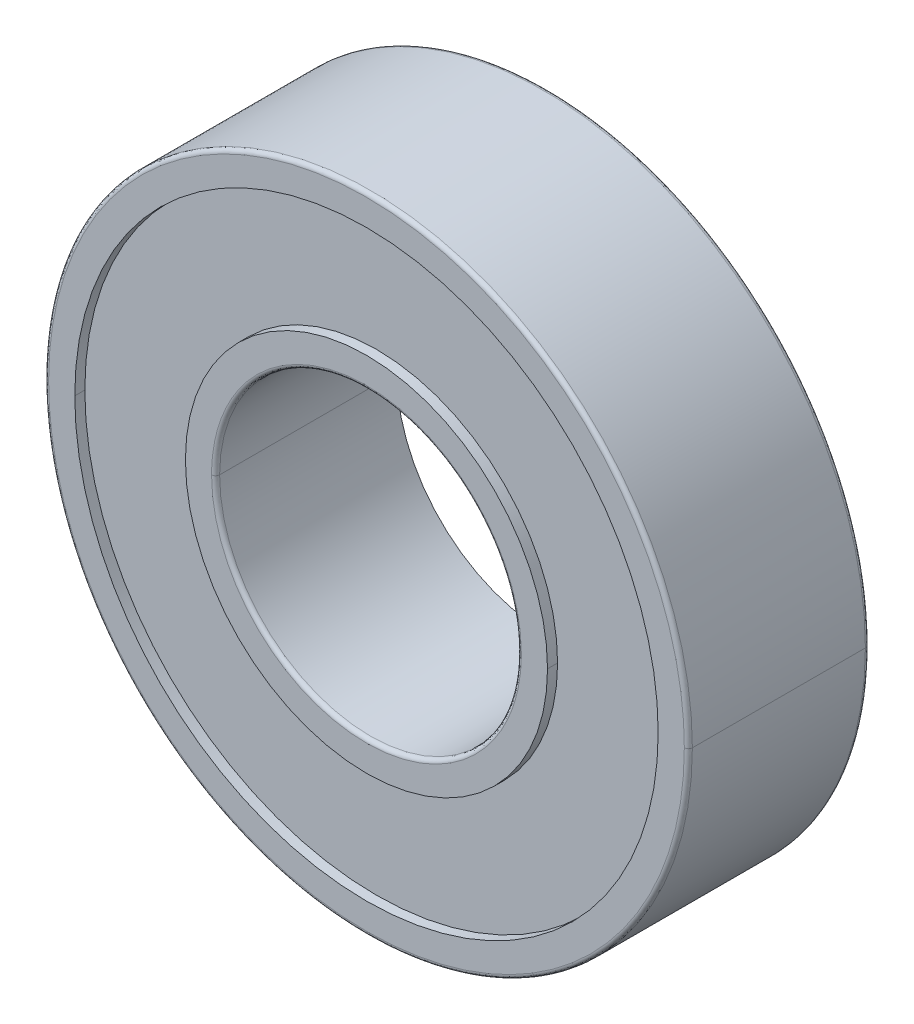
ISO-10303-21;
HEADER;
FILE_DESCRIPTION(('STEP AP214'),'2;1');
FILE_NAME('part.step','',(''),(''),'','','');
FILE_SCHEMA(('AUTOMOTIVE_DESIGN { 1 0 10303 214 1 1 1 1 }'));
ENDSEC;
DATA;
#1=APPLICATION_CONTEXT('core data for automotive mechanical design processes');
#2=APPLICATION_PROTOCOL_DEFINITION('international standard','automotive_design',2000,#1);
#3=PRODUCT_CONTEXT('',#1,'mechanical');
#4=PRODUCT('Part','Part','',(#3));
#5=PRODUCT_RELATED_PRODUCT_CATEGORY('part','',(#4));
#6=PRODUCT_DEFINITION_FORMATION('','',#4);
#7=PRODUCT_DEFINITION_CONTEXT('part definition',#1,'design');
#8=PRODUCT_DEFINITION('design','',#6,#7);
#9=PRODUCT_DEFINITION_SHAPE('','',#8);
#10=(LENGTH_UNIT() NAMED_UNIT(*) SI_UNIT(.MILLI.,.METRE.));
#11=(NAMED_UNIT(*) PLANE_ANGLE_UNIT() SI_UNIT($,.RADIAN.));
#12=(NAMED_UNIT(*) SI_UNIT($,.STERADIAN.) SOLID_ANGLE_UNIT());
#13=UNCERTAINTY_MEASURE_WITH_UNIT(LENGTH_MEASURE(1.E-05),#10,'distance_accuracy_value','');
#14=(GEOMETRIC_REPRESENTATION_CONTEXT(3) GLOBAL_UNCERTAINTY_ASSIGNED_CONTEXT((#13)) GLOBAL_UNIT_ASSIGNED_CONTEXT((#10,
#11,#12)) REPRESENTATION_CONTEXT('',''));
#15=CARTESIAN_POINT('',(0.,0.,0.));
#16=DIRECTION('',(0.,0.,1.));
#17=DIRECTION('',(1.,0.,0.));
#18=AXIS2_PLACEMENT_3D('',#15,#16,#17);
#19=CARTESIAN_POINT('',(0.,0.,8.5));
#20=DIRECTION('',(0.,0.,1.));
#21=DIRECTION('',(1.,0.,0.));
#22=AXIS2_PLACEMENT_3D('',#19,#20,#21);
#23=CYLINDRICAL_SURFACE('',#22,14.5);
#24=DIRECTION('',(0.,0.,1.));
#25=VECTOR('',#24,1.);
#26=CARTESIAN_POINT('',(-14.5,0.,8.5));
#27=LINE('',#26,#25);
#28=CARTESIAN_POINT('',(-14.5,0.,8.5));
#29=VERTEX_POINT('',#28);
#30=CARTESIAN_POINT('',(-14.5,0.,9.));
#31=VERTEX_POINT('',#30);
#32=EDGE_CURVE('E252',#29,#31,#27,.T.);
#33=ORIENTED_EDGE('',*,*,#32,.F.);
#34=CARTESIAN_POINT('',(0.,0.,8.5));
#35=DIRECTION('',(0.,0.,1.));
#36=DIRECTION('',(1.,0.,0.));
#37=AXIS2_PLACEMENT_3D('',#34,#35,#36);
#38=CIRCLE('',#37,14.5);
#39=CARTESIAN_POINT('',(14.5,0.,8.5));
#40=VERTEX_POINT('',#39);
#41=EDGE_CURVE('E31',#40,#29,#38,.T.);
#42=ORIENTED_EDGE('',*,*,#41,.F.);
#43=DIRECTION('',(0.,0.,1.));
#44=VECTOR('',#43,1.);
#45=CARTESIAN_POINT('',(14.5,0.,8.5));
#46=LINE('',#45,#44);
#47=CARTESIAN_POINT('',(14.5,0.,9.));
#48=VERTEX_POINT('',#47);
#49=EDGE_CURVE('E263',#40,#48,#46,.T.);
#50=ORIENTED_EDGE('',*,*,#49,.T.);
#51=CARTESIAN_POINT('',(0.,0.,9.));
#52=DIRECTION('',(0.,0.,-1.));
#53=DIRECTION('',(1.,0.,0.));
#54=AXIS2_PLACEMENT_3D('',#51,#52,#53);
#55=CIRCLE('',#54,14.5);
#56=EDGE_CURVE('E11',#31,#48,#55,.T.);
#57=ORIENTED_EDGE('',*,*,#56,.F.);
#58=EDGE_LOOP('',(#33,#42,#50,#57));
#59=FACE_BOUND('',#58,.T.);
#60=ADVANCED_FACE('F16',(#59),#23,.F.);
#61=CARTESIAN_POINT('',(-15.9896,-15.9896,9.));
#62=DIRECTION('',(0.,0.,1.));
#63=DIRECTION('',(1.,0.,0.));
#64=AXIS2_PLACEMENT_3D('',#61,#62,#63);
#65=PLANE('',#64);
#66=CARTESIAN_POINT('',(0.,0.,9.));
#67=DIRECTION('',(0.,0.,-1.));
#68=DIRECTION('',(1.,0.,0.));
#69=AXIS2_PLACEMENT_3D('',#66,#67,#68);
#70=CIRCLE('',#69,14.5);
#71=EDGE_CURVE('E256',#48,#31,#70,.T.);
#72=ORIENTED_EDGE('',*,*,#71,.T.);
#73=ORIENTED_EDGE('',*,*,#56,.T.);
#74=EDGE_LOOP('',(#72,#73));
#75=FACE_BOUND('',#74,.T.);
#76=CARTESIAN_POINT('',(-15.7999999971772,0.,9.00000000000697));
#77=CARTESIAN_POINT('',(-15.8000000005927,31.6000000003168,9.00000000001161));
#78=CARTESIAN_POINT('',(15.8000000005927,31.6000000003168,9.00000000001161));
#79=CARTESIAN_POINT('',(15.7999999971772,0.,9.00000000000697));
#80=(BOUNDED_CURVE() B_SPLINE_CURVE(3,(#76,#77,#78,#79),.UNSPECIFIED.,.F.,
.F.) B_SPLINE_CURVE_WITH_KNOTS((4,4),(0.,1.),
.UNSPECIFIED.) CURVE() GEOMETRIC_REPRESENTATION_ITEM() RATIONAL_B_SPLINE_CURVE((0.956578301732853,
0.318859433910951,0.318859433910951,0.956578301732853)) REPRESENTATION_ITEM(''));
#81=CARTESIAN_POINT('',(-15.7999999971772,0.,9.00000000000697));
#82=VERTEX_POINT('',#81);
#83=CARTESIAN_POINT('',(15.7999999971772,0.,9.00000000000697));
#84=VERTEX_POINT('',#83);
#85=EDGE_CURVE('E45',#82,#84,#80,.T.);
#86=ORIENTED_EDGE('',*,*,#85,.F.);
#87=CARTESIAN_POINT('',(15.7999999971772,0.,9.00000000000697));
#88=CARTESIAN_POINT('',(15.8000000005927,-31.6000000003169,9.00000000001161));
#89=CARTESIAN_POINT('',(-15.8000000005927,-31.6000000003169,9.00000000001161));
#90=CARTESIAN_POINT('',(-15.7999999971772,0.,9.00000000000697));
#91=(BOUNDED_CURVE() B_SPLINE_CURVE(3,(#87,#88,#89,#90),.UNSPECIFIED.,.F.,
.F.) B_SPLINE_CURVE_WITH_KNOTS((4,4),(0.,1.),
.UNSPECIFIED.) CURVE() GEOMETRIC_REPRESENTATION_ITEM() RATIONAL_B_SPLINE_CURVE((0.956578301732856,
0.318859433910952,0.318859433910952,0.956578301732856)) REPRESENTATION_ITEM(''));
#92=EDGE_CURVE('E324',#84,#82,#91,.T.);
#93=ORIENTED_EDGE('',*,*,#92,.F.);
#94=EDGE_LOOP('',(#86,#93));
#95=FACE_BOUND('',#94,.T.);
#96=ADVANCED_FACE('F578',(#75,#95),#65,.T.);
#97=CARTESIAN_POINT('',(-14.674,-14.674,8.5));
#98=DIRECTION('',(0.,0.,1.));
#99=DIRECTION('',(1.,0.,0.));
#100=AXIS2_PLACEMENT_3D('',#97,#98,#99);
#101=PLANE('',#100);
#102=CARTESIAN_POINT('',(0.,0.,8.5));
#103=DIRECTION('',(0.,0.,-1.));
#104=DIRECTION('',(1.,0.,0.));
#105=AXIS2_PLACEMENT_3D('',#102,#103,#104);
#106=CIRCLE('',#105,9.);
#107=CARTESIAN_POINT('',(9.,0.,8.5));
#108=VERTEX_POINT('',#107);
#109=CARTESIAN_POINT('',(-9.,0.,8.5));
#110=VERTEX_POINT('',#109);
#111=EDGE_CURVE('E213',#108,#110,#106,.T.);
#112=ORIENTED_EDGE('',*,*,#111,.T.);
#113=CARTESIAN_POINT('',(0.,0.,8.5));
#114=DIRECTION('',(0.,0.,-1.));
#115=DIRECTION('',(1.,0.,0.));
#116=AXIS2_PLACEMENT_3D('',#113,#114,#115);
#117=CIRCLE('',#116,9.);
#118=EDGE_CURVE('E240',#110,#108,#117,.T.);
#119=ORIENTED_EDGE('',*,*,#118,.T.);
#120=EDGE_LOOP('',(#112,#119));
#121=FACE_BOUND('',#120,.T.);
#122=ORIENTED_EDGE('',*,*,#41,.T.);
#123=CARTESIAN_POINT('',(0.,0.,8.5));
#124=DIRECTION('',(0.,0.,1.));
#125=DIRECTION('',(1.,0.,0.));
#126=AXIS2_PLACEMENT_3D('',#123,#124,#125);
#127=CIRCLE('',#126,14.5);
#128=EDGE_CURVE('E257',#29,#40,#127,.T.);
#129=ORIENTED_EDGE('',*,*,#128,.T.);
#130=EDGE_LOOP('',(#122,#129));
#131=FACE_BOUND('',#130,.T.);
#132=ADVANCED_FACE('F573',(#121,#131),#101,.T.);
#133=CARTESIAN_POINT('',(15.780033317,0.,8.999000833));
#134=CARTESIAN_POINT('',(15.780033317,31.560066633,8.999000833));
#135=CARTESIAN_POINT('',(-15.780033317,31.560066633,8.999000833));
#136=CARTESIAN_POINT('',(-15.780033317,0.,8.999000833));
#137=CARTESIAN_POINT('',(15.916010753,0.,9.01264408500001));
#138=CARTESIAN_POINT('',(15.916010753,31.832021506,9.012644085));
#139=CARTESIAN_POINT('',(-15.916010753,31.832021506,9.012644085));
#140=CARTESIAN_POINT('',(-15.916010753,0.,9.01264408500001));
#141=CARTESIAN_POINT('',(16.012644085,0.,8.91601075300001));
#142=CARTESIAN_POINT('',(16.012644085,32.025288169,8.916010753));
#143=CARTESIAN_POINT('',(-16.012644085,32.025288169,8.916010753));
#144=CARTESIAN_POINT('',(-16.012644085,0.,8.91601075300001));
#145=CARTESIAN_POINT('',(15.999000833,0.,8.780033317));
#146=CARTESIAN_POINT('',(15.999000833,31.998001666,8.780033317));
#147=CARTESIAN_POINT('',(-15.999000833,31.998001666,8.780033317));
#148=CARTESIAN_POINT('',(-15.999000833,0.,8.780033317));
#149=(BOUNDED_SURFACE() B_SPLINE_SURFACE(3,3,((#133,#134,#135,#136),(#137,#138,#139,#140),(#141,
#142,#143,#144),(#145,#146,#147,#148)),.UNSPECIFIED.,.F.,.F.,
.F.) B_SPLINE_SURFACE_WITH_KNOTS((4,4),(4,4),(0.,1.),(0.,1.),
.UNSPECIFIED.) GEOMETRIC_REPRESENTATION_ITEM() RATIONAL_B_SPLINE_SURFACE(((1.,0.333333333333333,
0.333333333333333,1.),(0.755320871117974,0.251773623705991,0.251773623705991,0.755320871117974),
(0.755320871117974,0.251773623705991,0.251773623705991,0.755320871117974),(1.,0.333333333333333,
0.333333333333333,1.))) REPRESENTATION_ITEM('') SURFACE());
#150=CARTESIAN_POINT('',(16.0000000000029,-4.92248228436794E-09,8.8000000000935));
#151=CARTESIAN_POINT('',(16.0000000003088,0.,8.91715728756898));
#152=CARTESIAN_POINT('',(15.917157287569,0.,9.00000000030878));
#153=CARTESIAN_POINT('',(15.7999999971771,0.,9.00000000000696));
#154=(BOUNDED_CURVE() B_SPLINE_CURVE(3,(#150,#151,#152,#153),.UNSPECIFIED.,.F.,
.F.) B_SPLINE_CURVE_WITH_KNOTS((4,4),(0.0631414569999932,0.93685854300001),
.UNSPECIFIED.) CURVE() GEOMETRIC_REPRESENTATION_ITEM() RATIONAL_B_SPLINE_CURVE((0.956578302165998,
0.769794770395974,0.769794770395975,0.956578302166)) REPRESENTATION_ITEM(''));
#155=CARTESIAN_POINT('',(16.0000000000029,-4.92248228436795E-09,8.80000000009351));
#156=VERTEX_POINT('',#155);
#157=EDGE_CURVE('E216',#156,#84,#154,.T.);
#158=CARTESIAN_POINT('',(0.,0.,8.8));
#159=DIRECTION('',(0.,0.,1.));
#160=DIRECTION('',(-1.,0.,0.));
#161=AXIS2_PLACEMENT_3D('',#158,#159,#160);
#162=CIRCLE('',#161,16.);
#163=CARTESIAN_POINT('',(-16.0000000000029,-1.43669805485973E-09,8.8));
#164=VERTEX_POINT('',#163);
#165=EDGE_CURVE('E225',#156,#164,#162,.T.);
#166=CARTESIAN_POINT('',(-15.7999999971771,0.,9.00000000000696));
#167=CARTESIAN_POINT('',(-15.9171572877615,0.,9.00000000030878));
#168=CARTESIAN_POINT('',(-16.0000000005279,0.,8.91715728734989));
#169=CARTESIAN_POINT('',(-16.0000000000029,-1.43669805485973E-09,8.8));
#170=(BOUNDED_CURVE() B_SPLINE_CURVE(3,(#166,#167,#168,#169),.UNSPECIFIED.,.F.,
.F.) B_SPLINE_CURVE_WITH_KNOTS((4,4),(0.063141456999981,0.936858544155373),
.UNSPECIFIED.) CURVE() GEOMETRIC_REPRESENTATION_ITEM() RATIONAL_B_SPLINE_CURVE((0.956578302166006,
0.76979477014898,0.769794770395972,0.956578302906982)) REPRESENTATION_ITEM(''));
#171=EDGE_CURVE('E141',#82,#164,#170,.T.);
#172=ORIENTED_EDGE('',*,*,#85,.T.);
#173=ORIENTED_EDGE('',*,*,#157,.F.);
#174=ORIENTED_EDGE('',*,*,#165,.T.);
#175=ORIENTED_EDGE('',*,*,#171,.F.);
#176=EDGE_LOOP('',(#172,#173,#174,#175));
#177=FACE_BOUND('',#176,.T.);
#178=ADVANCED_FACE('F577',(#177),#149,.T.);
#179=CARTESIAN_POINT('',(-15.780033317,0.,8.999000833));
#180=CARTESIAN_POINT('',(-15.780033317,-31.560066633,8.999000833));
#181=CARTESIAN_POINT('',(15.780033317,-31.560066633,8.999000833));
#182=CARTESIAN_POINT('',(15.780033317,0.,8.999000833));
#183=CARTESIAN_POINT('',(-15.916010753,0.,9.01264408500001));
#184=CARTESIAN_POINT('',(-15.916010753,-31.832021506,9.012644085));
#185=CARTESIAN_POINT('',(15.916010753,-31.832021506,9.012644085));
#186=CARTESIAN_POINT('',(15.916010753,0.,9.01264408500001));
#187=CARTESIAN_POINT('',(-16.012644085,0.,8.91601075300001));
#188=CARTESIAN_POINT('',(-16.012644085,-32.025288169,8.916010753));
#189=CARTESIAN_POINT('',(16.012644085,-32.025288169,8.916010753));
#190=CARTESIAN_POINT('',(16.012644085,0.,8.91601075300001));
#191=CARTESIAN_POINT('',(-15.999000833,0.,8.780033317));
#192=CARTESIAN_POINT('',(-15.999000833,-31.998001666,8.780033317));
#193=CARTESIAN_POINT('',(15.999000833,-31.998001666,8.780033317));
#194=CARTESIAN_POINT('',(15.999000833,0.,8.780033317));
#195=(BOUNDED_SURFACE() B_SPLINE_SURFACE(3,3,((#179,#180,#181,#182),(#183,#184,#185,#186),(#187,
#188,#189,#190),(#191,#192,#193,#194)),.UNSPECIFIED.,.F.,.F.,
.F.) B_SPLINE_SURFACE_WITH_KNOTS((4,4),(4,4),(0.,1.),(0.,1.),
.UNSPECIFIED.) GEOMETRIC_REPRESENTATION_ITEM() RATIONAL_B_SPLINE_SURFACE(((1.,0.333333333333333,
0.333333333333333,1.),(0.755320871117974,0.251773623705991,0.251773623705991,0.755320871117974),
(0.755320871117974,0.251773623705991,0.251773623705991,0.755320871117974),(1.,0.333333333333333,
0.333333333333333,1.))) REPRESENTATION_ITEM('') SURFACE());
#196=CARTESIAN_POINT('',(0.,0.,8.8));
#197=DIRECTION('',(0.,0.,1.));
#198=DIRECTION('',(-1.,0.,0.));
#199=AXIS2_PLACEMENT_3D('',#196,#197,#198);
#200=CIRCLE('',#199,16.);
#201=EDGE_CURVE('E217',#164,#156,#200,.T.);
#202=ORIENTED_EDGE('',*,*,#157,.T.);
#203=ORIENTED_EDGE('',*,*,#92,.T.);
#204=ORIENTED_EDGE('',*,*,#171,.T.);
#205=ORIENTED_EDGE('',*,*,#201,.T.);
#206=EDGE_LOOP('',(#202,#203,#204,#205));
#207=FACE_BOUND('',#206,.T.);
#208=ADVANCED_FACE('F18',(#207),#195,.T.);
#209=CARTESIAN_POINT('',(0.,0.,8.5));
#210=DIRECTION('',(0.,0.,1.));
#211=DIRECTION('',(1.,0.,0.));
#212=AXIS2_PLACEMENT_3D('',#209,#210,#211);
#213=CYLINDRICAL_SURFACE('',#212,9.);
#214=DIRECTION('',(0.,0.,1.));
#215=VECTOR('',#214,1.);
#216=CARTESIAN_POINT('',(-9.,0.,8.5));
#217=LINE('',#216,#215);
#218=CARTESIAN_POINT('',(-9.,0.,9.));
#219=VERTEX_POINT('',#218);
#220=EDGE_CURVE('E247',#110,#219,#217,.T.);
#221=ORIENTED_EDGE('',*,*,#220,.F.);
#222=ORIENTED_EDGE('',*,*,#111,.F.);
#223=DIRECTION('',(0.,0.,1.));
#224=VECTOR('',#223,1.);
#225=CARTESIAN_POINT('',(9.,0.,8.5));
#226=LINE('',#225,#224);
#227=CARTESIAN_POINT('',(9.,0.,9.));
#228=VERTEX_POINT('',#227);
#229=EDGE_CURVE('E288',#108,#228,#226,.T.);
#230=ORIENTED_EDGE('',*,*,#229,.T.);
#231=CARTESIAN_POINT('',(0.,0.,9.));
#232=DIRECTION('',(0.,0.,1.));
#233=DIRECTION('',(1.,0.,0.));
#234=AXIS2_PLACEMENT_3D('',#231,#232,#233);
#235=CIRCLE('',#234,9.);
#236=EDGE_CURVE('E220',#219,#228,#235,.T.);
#237=ORIENTED_EDGE('',*,*,#236,.F.);
#238=EDGE_LOOP('',(#221,#222,#230,#237));
#239=FACE_BOUND('',#238,.T.);
#240=ADVANCED_FACE('F605',(#239),#213,.T.);
#241=CARTESIAN_POINT('',(0.,0.,8.8));
#242=DIRECTION('',(0.,0.,-1.));
#243=DIRECTION('',(-1.,0.,0.));
#244=AXIS2_PLACEMENT_3D('',#241,#242,#243);
#245=CYLINDRICAL_SURFACE('',#244,16.);
#246=DIRECTION('',(0.,0.,-1.));
#247=VECTOR('',#246,1.);
#248=CARTESIAN_POINT('',(16.,0.,8.8));
#249=LINE('',#248,#247);
#250=CARTESIAN_POINT('',(16.0000000000087,-1.64082742812265E-09,0.199999999625981));
#251=VERTEX_POINT('',#250);
#252=EDGE_CURVE('E221',#156,#251,#249,.T.);
#253=ORIENTED_EDGE('',*,*,#252,.F.);
#254=ORIENTED_EDGE('',*,*,#201,.F.);
#255=DIRECTION('',(0.,0.,-1.));
#256=VECTOR('',#255,1.);
#257=CARTESIAN_POINT('',(-16.,0.,8.8));
#258=LINE('',#257,#256);
#259=CARTESIAN_POINT('',(-16.0000000000087,-1.07752354114493E-09,0.199999999625981));
#260=VERTEX_POINT('',#259);
#261=EDGE_CURVE('E234',#164,#260,#258,.T.);
#262=ORIENTED_EDGE('',*,*,#261,.T.);
#263=CARTESIAN_POINT('',(0.,0.,0.199999999625981));
#264=DIRECTION('',(0.,0.,-1.));
#265=DIRECTION('',(0.,1.,0.));
#266=AXIS2_PLACEMENT_3D('',#263,#264,#265);
#267=CIRCLE('',#266,16.0000000000116);
#268=EDGE_CURVE('E154',#251,#260,#267,.T.);
#269=ORIENTED_EDGE('',*,*,#268,.F.);
#270=EDGE_LOOP('',(#253,#254,#262,#269));
#271=FACE_BOUND('',#270,.T.);
#272=ADVANCED_FACE('F612',(#271),#245,.T.);
#273=CARTESIAN_POINT('',(-9.108,-9.108,9.));
#274=DIRECTION('',(0.,0.,1.));
#275=DIRECTION('',(1.,0.,0.));
#276=AXIS2_PLACEMENT_3D('',#273,#274,#275);
#277=PLANE('',#276);
#278=CARTESIAN_POINT('',(-7.69999999961773,0.,9.00000000000697));
#279=CARTESIAN_POINT('',(-7.69999999940734,-15.3999999996832,9.0000000000116));
#280=CARTESIAN_POINT('',(7.69999999940734,-15.3999999996832,9.0000000000116));
#281=CARTESIAN_POINT('',(7.69999999961773,0.,9.00000000000697));
#282=(BOUNDED_CURVE() B_SPLINE_CURVE(3,(#278,#279,#280,#281),.UNSPECIFIED.,.F.,
.F.) B_SPLINE_CURVE_WITH_KNOTS((4,4),(0.,1.),
.UNSPECIFIED.) CURVE() GEOMETRIC_REPRESENTATION_ITEM() RATIONAL_B_SPLINE_CURVE((0.956578301732844,
0.318859433910948,0.318859433910948,0.956578301732844)) REPRESENTATION_ITEM(''));
#283=CARTESIAN_POINT('',(-7.69999999961774,0.,9.00000000000697));
#284=VERTEX_POINT('',#283);
#285=CARTESIAN_POINT('',(7.69999999961774,0.,9.00000000000697));
#286=VERTEX_POINT('',#285);
#287=EDGE_CURVE('E296',#284,#286,#282,.T.);
#288=ORIENTED_EDGE('',*,*,#287,.F.);
#289=CARTESIAN_POINT('',(7.69999999961773,0.,9.00000000000696));
#290=CARTESIAN_POINT('',(7.69999999940734,15.3999999996832,9.00000000001161));
#291=CARTESIAN_POINT('',(-7.69999999940734,15.3999999996832,9.00000000001161));
#292=CARTESIAN_POINT('',(-7.69999999961773,0.,9.00000000000696));
#293=(BOUNDED_CURVE() B_SPLINE_CURVE(3,(#289,#290,#291,#292),.UNSPECIFIED.,.F.,
.F.) B_SPLINE_CURVE_WITH_KNOTS((4,4),(0.,1.),
.UNSPECIFIED.) CURVE() GEOMETRIC_REPRESENTATION_ITEM() RATIONAL_B_SPLINE_CURVE((0.956578301732845,
0.318859433910948,0.318859433910948,0.956578301732845)) REPRESENTATION_ITEM(''));
#294=EDGE_CURVE('E22',#286,#284,#293,.T.);
#295=ORIENTED_EDGE('',*,*,#294,.F.);
#296=EDGE_LOOP('',(#288,#295));
#297=FACE_BOUND('',#296,.T.);
#298=CARTESIAN_POINT('',(0.,0.,9.));
#299=DIRECTION('',(0.,0.,1.));
#300=DIRECTION('',(1.,0.,0.));
#301=AXIS2_PLACEMENT_3D('',#298,#299,#300);
#302=CIRCLE('',#301,9.);
#303=EDGE_CURVE('E350',#228,#219,#302,.T.);
#304=ORIENTED_EDGE('',*,*,#303,.T.);
#305=ORIENTED_EDGE('',*,*,#236,.T.);
#306=EDGE_LOOP('',(#304,#305));
#307=FACE_BOUND('',#306,.T.);
#308=ADVANCED_FACE('F620',(#297,#307),#277,.T.);
#309=CARTESIAN_POINT('',(15.999000833,0.,0.219966683));
#310=CARTESIAN_POINT('',(15.999000833,31.998001666,0.219966683));
#311=CARTESIAN_POINT('',(-15.999000833,31.998001666,0.219966683));
#312=CARTESIAN_POINT('',(-15.999000833,0.,0.219966683));
#313=CARTESIAN_POINT('',(16.012644085,0.,0.083989247));
#314=CARTESIAN_POINT('',(16.012644085,32.025288169,0.0839892470000001));
#315=CARTESIAN_POINT('',(-16.012644085,32.025288169,0.0839892470000001));
#316=CARTESIAN_POINT('',(-16.012644085,0.,0.083989247));
#317=CARTESIAN_POINT('',(15.916010753,0.,-0.012644085));
#318=CARTESIAN_POINT('',(15.916010753,31.832021506,-0.012644085));
#319=CARTESIAN_POINT('',(-15.916010753,31.832021506,-0.012644085));
#320=CARTESIAN_POINT('',(-15.916010753,0.,-0.012644085));
#321=CARTESIAN_POINT('',(15.780033317,0.,0.000999167));
#322=CARTESIAN_POINT('',(15.780033317,31.560066633,0.000999167));
#323=CARTESIAN_POINT('',(-15.780033317,31.560066633,0.000999167));
#324=CARTESIAN_POINT('',(-15.780033317,0.,0.000999167));
#325=(BOUNDED_SURFACE() B_SPLINE_SURFACE(3,3,((#309,#310,#311,#312),(#313,#314,#315,#316),(#317,
#318,#319,#320),(#321,#322,#323,#324)),.UNSPECIFIED.,.F.,.F.,
.F.) B_SPLINE_SURFACE_WITH_KNOTS((4,4),(4,4),(0.,1.),(0.,1.),
.UNSPECIFIED.) GEOMETRIC_REPRESENTATION_ITEM() RATIONAL_B_SPLINE_SURFACE(((1.,0.333333333333333,
0.333333333333333,1.),(0.755320871117973,0.251773623705991,0.251773623705991,0.755320871117973),
(0.755320871117973,0.251773623705991,0.251773623705991,0.755320871117973),(1.,0.333333333333333,
0.333333333333333,1.))) REPRESENTATION_ITEM('') SURFACE());
#326=CARTESIAN_POINT('',(0.,0.,0.199999999625981));
#327=DIRECTION('',(0.,0.,-1.));
#328=DIRECTION('',(0.,1.,0.));
#329=AXIS2_PLACEMENT_3D('',#326,#327,#328);
#330=CIRCLE('',#329,16.0000000000116);
#331=EDGE_CURVE('E224',#260,#251,#330,.T.);
#332=CARTESIAN_POINT('',(15.7999999971771,0.,-6.96372145903885E-12));
#333=CARTESIAN_POINT('',(15.917157287569,0.,-3.08778615747303E-10));
#334=CARTESIAN_POINT('',(16.0000000003088,0.,0.0828427124310209));
#335=CARTESIAN_POINT('',(16.0000000000087,-1.64082742812265E-09,0.199999999625981));
#336=(BOUNDED_CURVE() B_SPLINE_CURVE(3,(#332,#333,#334,#335),.UNSPECIFIED.,.F.,
.F.) B_SPLINE_CURVE_WITH_KNOTS((4,4),(0.063141457000004,0.936858543),
.UNSPECIFIED.) CURVE() GEOMETRIC_REPRESENTATION_ITEM() RATIONAL_B_SPLINE_CURVE((0.956578302165991,
0.769794770395975,0.769794770395976,0.956578302165993)) REPRESENTATION_ITEM(''));
#337=CARTESIAN_POINT('',(15.7999999971772,0.,-6.96372145903886E-12));
#338=VERTEX_POINT('',#337);
#339=EDGE_CURVE('E268',#338,#251,#336,.T.);
#340=CARTESIAN_POINT('',(15.7999999971772,0.,-6.96372145903885E-12));
#341=CARTESIAN_POINT('',(15.8000000005926,31.6000000003168,-1.16062032858886E-11));
#342=CARTESIAN_POINT('',(-15.8000000005926,31.6000000003168,-1.16062032858886E-11));
#343=CARTESIAN_POINT('',(-15.7999999971772,0.,-6.96372145903885E-12));
#344=(BOUNDED_CURVE() B_SPLINE_CURVE(3,(#340,#341,#342,#343),.UNSPECIFIED.,.F.,
.F.) B_SPLINE_CURVE_WITH_KNOTS((4,4),(0.,1.),
.UNSPECIFIED.) CURVE() GEOMETRIC_REPRESENTATION_ITEM() RATIONAL_B_SPLINE_CURVE((0.956578301732849,
0.31885943391095,0.31885943391095,0.956578301732849)) REPRESENTATION_ITEM(''));
#345=CARTESIAN_POINT('',(-15.7999999971772,0.,-6.96372145903886E-12));
#346=VERTEX_POINT('',#345);
#347=EDGE_CURVE('E212',#338,#346,#344,.T.);
#348=CARTESIAN_POINT('',(-16.0000000000087,-1.07752354114493E-09,0.199999999625981));
#349=CARTESIAN_POINT('',(-16.0000000003088,0.,0.0828427124310209));
#350=CARTESIAN_POINT('',(-15.917157287569,0.,-3.0877860250206E-10));
#351=CARTESIAN_POINT('',(-15.7999999971772,0.,-6.96372145903886E-12));
#352=(BOUNDED_CURVE() B_SPLINE_CURVE(3,(#348,#349,#350,#351),.UNSPECIFIED.,.F.,
.F.) B_SPLINE_CURVE_WITH_KNOTS((4,4),(0.0631414569999998,0.936858542999996),
.UNSPECIFIED.) CURVE() GEOMETRIC_REPRESENTATION_ITEM() RATIONAL_B_SPLINE_CURVE((0.956578302165993,
0.769794770395976,0.769794770395975,0.956578302165991)) REPRESENTATION_ITEM(''));
#353=EDGE_CURVE('E267',#260,#346,#352,.T.);
#354=ORIENTED_EDGE('',*,*,#331,.T.);
#355=ORIENTED_EDGE('',*,*,#339,.F.);
#356=ORIENTED_EDGE('',*,*,#347,.T.);
#357=ORIENTED_EDGE('',*,*,#353,.F.);
#358=EDGE_LOOP('',(#354,#355,#356,#357));
#359=FACE_BOUND('',#358,.T.);
#360=ADVANCED_FACE('F628',(#359),#325,.T.);
#361=CARTESIAN_POINT('',(-15.999000833,0.,0.219966683));
#362=CARTESIAN_POINT('',(-15.999000833,-31.998001666,0.219966683));
#363=CARTESIAN_POINT('',(15.999000833,-31.998001666,0.219966683));
#364=CARTESIAN_POINT('',(15.999000833,0.,0.219966683));
#365=CARTESIAN_POINT('',(-16.012644085,0.,0.083989247));
#366=CARTESIAN_POINT('',(-16.012644085,-32.025288169,0.0839892470000001));
#367=CARTESIAN_POINT('',(16.012644085,-32.025288169,0.0839892470000001));
#368=CARTESIAN_POINT('',(16.012644085,0.,0.083989247));
#369=CARTESIAN_POINT('',(-15.916010753,0.,-0.012644085));
#370=CARTESIAN_POINT('',(-15.916010753,-31.832021506,-0.012644085));
#371=CARTESIAN_POINT('',(15.916010753,-31.832021506,-0.012644085));
#372=CARTESIAN_POINT('',(15.916010753,0.,-0.012644085));
#373=CARTESIAN_POINT('',(-15.780033317,0.,0.000999167));
#374=CARTESIAN_POINT('',(-15.780033317,-31.560066633,0.000999167));
#375=CARTESIAN_POINT('',(15.780033317,-31.560066633,0.000999167));
#376=CARTESIAN_POINT('',(15.780033317,0.,0.000999167));
#377=(BOUNDED_SURFACE() B_SPLINE_SURFACE(3,3,((#361,#362,#363,#364),(#365,#366,#367,#368),(#369,
#370,#371,#372),(#373,#374,#375,#376)),.UNSPECIFIED.,.F.,.F.,
.F.) B_SPLINE_SURFACE_WITH_KNOTS((4,4),(4,4),(0.,1.),(0.,1.),
.UNSPECIFIED.) GEOMETRIC_REPRESENTATION_ITEM() RATIONAL_B_SPLINE_SURFACE(((1.,0.333333333333333,
0.333333333333333,1.),(0.755320871117973,0.251773623705991,0.251773623705991,0.755320871117973),
(0.755320871117973,0.251773623705991,0.251773623705991,0.755320871117973),(1.,0.333333333333333,
0.333333333333333,1.))) REPRESENTATION_ITEM('') SURFACE());
#378=CARTESIAN_POINT('',(-15.7999999971771,0.,-6.96372145903886E-12));
#379=CARTESIAN_POINT('',(-15.8000000005926,-31.6000000003168,-1.16062033016517E-11));
#380=CARTESIAN_POINT('',(15.8000000005926,-31.6000000003168,-1.16062033016517E-11));
#381=CARTESIAN_POINT('',(15.7999999971771,0.,-6.96372145903886E-12));
#382=(BOUNDED_CURVE() B_SPLINE_CURVE(3,(#378,#379,#380,#381),.UNSPECIFIED.,.F.,
.F.) B_SPLINE_CURVE_WITH_KNOTS((4,4),(0.,1.),
.UNSPECIFIED.) CURVE() GEOMETRIC_REPRESENTATION_ITEM() RATIONAL_B_SPLINE_CURVE((0.956578301732851,
0.31885943391095,0.31885943391095,0.956578301732851)) REPRESENTATION_ITEM(''));
#383=EDGE_CURVE('E289',#346,#338,#382,.T.);
#384=ORIENTED_EDGE('',*,*,#339,.T.);
#385=ORIENTED_EDGE('',*,*,#268,.T.);
#386=ORIENTED_EDGE('',*,*,#353,.T.);
#387=ORIENTED_EDGE('',*,*,#383,.T.);
#388=EDGE_LOOP('',(#384,#385,#386,#387));
#389=FACE_BOUND('',#388,.T.);
#390=ADVANCED_FACE('F637',(#389),#377,.T.);
#391=CARTESIAN_POINT('',(7.500999167,0.,8.780033317));
#392=CARTESIAN_POINT('',(7.500999167,15.001998334,8.780033317));
#393=CARTESIAN_POINT('',(-7.500999167,15.001998334,8.780033317));
#394=CARTESIAN_POINT('',(-7.500999167,0.,8.780033317));
#395=CARTESIAN_POINT('',(7.487355915,0.,8.91601075300001));
#396=CARTESIAN_POINT('',(7.487355915,14.974711831,8.916010753));
#397=CARTESIAN_POINT('',(-7.487355915,14.974711831,8.916010753));
#398=CARTESIAN_POINT('',(-7.487355915,0.,8.91601075300001));
#399=CARTESIAN_POINT('',(7.583989247,0.,9.012644085));
#400=CARTESIAN_POINT('',(7.583989247,15.167978494,9.012644085));
#401=CARTESIAN_POINT('',(-7.583989247,15.167978494,9.012644085));
#402=CARTESIAN_POINT('',(-7.583989247,0.,9.012644085));
#403=CARTESIAN_POINT('',(7.719966683,0.,8.999000833));
#404=CARTESIAN_POINT('',(7.719966683,15.439933367,8.999000833));
#405=CARTESIAN_POINT('',(-7.719966683,15.439933367,8.999000833));
#406=CARTESIAN_POINT('',(-7.719966683,0.,8.999000833));
#407=(BOUNDED_SURFACE() B_SPLINE_SURFACE(3,3,((#391,#392,#393,#394),(#395,#396,#397,#398),(#399,
#400,#401,#402),(#403,#404,#405,#406)),.UNSPECIFIED.,.F.,.F.,
.F.) B_SPLINE_SURFACE_WITH_KNOTS((4,4),(4,4),(0.,1.),(0.,1.),
.UNSPECIFIED.) GEOMETRIC_REPRESENTATION_ITEM() RATIONAL_B_SPLINE_SURFACE(((1.,0.333333333333333,
0.333333333333333,1.),(0.755320871117973,0.251773623705991,0.251773623705991,0.755320871117973),
(0.755320871117973,0.251773623705991,0.251773623705991,0.755320871117973),(1.,0.333333333333333,
0.333333333333333,1.))) REPRESENTATION_ITEM('') SURFACE());
#408=CARTESIAN_POINT('',(0.,0.,8.8));
#409=DIRECTION('',(0.,0.,1.));
#410=DIRECTION('',(-1.,0.,0.));
#411=AXIS2_PLACEMENT_3D('',#408,#409,#410);
#412=CIRCLE('',#411,7.5);
#413=CARTESIAN_POINT('',(7.4999999999971,-2.30741357079747E-09,8.80000000009351));
#414=VERTEX_POINT('',#413);
#415=CARTESIAN_POINT('',(-7.4999999999971,-1.01017831982325E-09,8.80000000009351));
#416=VERTEX_POINT('',#415);
#417=EDGE_CURVE('E179',#414,#416,#412,.T.);
#418=CARTESIAN_POINT('',(7.69999999961774,0.,9.00000000000696));
#419=CARTESIAN_POINT('',(7.58284271243103,0.,9.00000000030878));
#420=CARTESIAN_POINT('',(7.49999999969122,0.,8.91715728756898));
#421=CARTESIAN_POINT('',(7.4999999999971,-2.30741357079748E-09,8.80000000009352));
#422=(BOUNDED_CURVE() B_SPLINE_CURVE(3,(#418,#419,#420,#421),.UNSPECIFIED.,.F.,
.F.) B_SPLINE_CURVE_WITH_KNOTS((4,4),(0.0631414569999929,0.936858542999991),
.UNSPECIFIED.) CURVE() GEOMETRIC_REPRESENTATION_ITEM() RATIONAL_B_SPLINE_CURVE((0.956578302165998,
0.769794770395977,0.769794770395974,0.956578302165987)) REPRESENTATION_ITEM(''));
#423=EDGE_CURVE('E295',#286,#414,#422,.T.);
#424=CARTESIAN_POINT('',(-7.4999999999971,-1.01017831982325E-09,8.80000000009351));
#425=CARTESIAN_POINT('',(-7.49999999969121,0.,8.91715728756898));
#426=CARTESIAN_POINT('',(-7.58284271243102,0.,9.00000000030878));
#427=CARTESIAN_POINT('',(-7.69999999961774,0.,9.00000000000697));
#428=(BOUNDED_CURVE() B_SPLINE_CURVE(3,(#424,#425,#426,#427),.UNSPECIFIED.,.F.,
.F.) B_SPLINE_CURVE_WITH_KNOTS((4,4),(0.0631414570000028,0.936858543000003),
.UNSPECIFIED.) CURVE() GEOMETRIC_REPRESENTATION_ITEM() RATIONAL_B_SPLINE_CURVE((0.956578302165991,
0.769794770395975,0.769794770395976,0.956578302165995)) REPRESENTATION_ITEM(''));
#429=EDGE_CURVE('E305',#416,#284,#428,.T.);
#430=ORIENTED_EDGE('',*,*,#417,.F.);
#431=ORIENTED_EDGE('',*,*,#423,.F.);
#432=ORIENTED_EDGE('',*,*,#294,.T.);
#433=ORIENTED_EDGE('',*,*,#429,.F.);
#434=EDGE_LOOP('',(#430,#431,#432,#433));
#435=FACE_BOUND('',#434,.T.);
#436=ADVANCED_FACE('F434',(#435),#407,.T.);
#437=CARTESIAN_POINT('',(-7.500999167,0.,8.780033317));
#438=CARTESIAN_POINT('',(-7.500999167,-15.001998334,8.780033317));
#439=CARTESIAN_POINT('',(7.500999167,-15.001998334,8.780033317));
#440=CARTESIAN_POINT('',(7.500999167,0.,8.780033317));
#441=CARTESIAN_POINT('',(-7.487355915,0.,8.91601075300001));
#442=CARTESIAN_POINT('',(-7.487355915,-14.974711831,8.916010753));
#443=CARTESIAN_POINT('',(7.487355915,-14.974711831,8.916010753));
#444=CARTESIAN_POINT('',(7.487355915,0.,8.91601075300001));
#445=CARTESIAN_POINT('',(-7.583989247,0.,9.012644085));
#446=CARTESIAN_POINT('',(-7.583989247,-15.167978494,9.012644085));
#447=CARTESIAN_POINT('',(7.583989247,-15.167978494,9.012644085));
#448=CARTESIAN_POINT('',(7.583989247,0.,9.012644085));
#449=CARTESIAN_POINT('',(-7.719966683,0.,8.999000833));
#450=CARTESIAN_POINT('',(-7.719966683,-15.439933367,8.999000833));
#451=CARTESIAN_POINT('',(7.719966683,-15.439933367,8.999000833));
#452=CARTESIAN_POINT('',(7.719966683,0.,8.999000833));
#453=(BOUNDED_SURFACE() B_SPLINE_SURFACE(3,3,((#437,#438,#439,#440),(#441,#442,#443,#444),(#445,
#446,#447,#448),(#449,#450,#451,#452)),.UNSPECIFIED.,.F.,.F.,
.F.) B_SPLINE_SURFACE_WITH_KNOTS((4,4),(4,4),(0.,1.),(0.,1.),
.UNSPECIFIED.) GEOMETRIC_REPRESENTATION_ITEM() RATIONAL_B_SPLINE_SURFACE(((1.,0.333333333333333,
0.333333333333333,1.),(0.755320871117973,0.251773623705991,0.251773623705991,0.755320871117973),
(0.755320871117973,0.251773623705991,0.251773623705991,0.755320871117973),(1.,0.333333333333333,
0.333333333333333,1.))) REPRESENTATION_ITEM('') SURFACE());
#454=CARTESIAN_POINT('',(0.,0.,8.8));
#455=DIRECTION('',(0.,0.,1.));
#456=DIRECTION('',(-1.,0.,0.));
#457=AXIS2_PLACEMENT_3D('',#454,#455,#456);
#458=CIRCLE('',#457,7.5);
#459=EDGE_CURVE('E190',#416,#414,#458,.T.);
#460=ORIENTED_EDGE('',*,*,#423,.T.);
#461=ORIENTED_EDGE('',*,*,#459,.F.);
#462=ORIENTED_EDGE('',*,*,#429,.T.);
#463=ORIENTED_EDGE('',*,*,#287,.T.);
#464=EDGE_LOOP('',(#460,#461,#462,#463));
#465=FACE_BOUND('',#464,.T.);
#466=ADVANCED_FACE('F428',(#465),#453,.T.);
#467=CARTESIAN_POINT('',(-15.9896,-15.9896,0.));
#468=DIRECTION('',(0.,0.,1.));
#469=DIRECTION('',(1.,0.,0.));
#470=AXIS2_PLACEMENT_3D('',#467,#468,#469);
#471=PLANE('',#470);
#472=CARTESIAN_POINT('',(0.,0.,0.));
#473=DIRECTION('',(0.,0.,-1.));
#474=DIRECTION('',(-1.,0.,0.));
#475=AXIS2_PLACEMENT_3D('',#472,#473,#474);
#476=CIRCLE('',#475,14.5);
#477=CARTESIAN_POINT('',(-14.5,0.,0.));
#478=VERTEX_POINT('',#477);
#479=CARTESIAN_POINT('',(14.5,0.,0.));
#480=VERTEX_POINT('',#479);
#481=EDGE_CURVE('E169',#478,#480,#476,.T.);
#482=ORIENTED_EDGE('',*,*,#481,.F.);
#483=CARTESIAN_POINT('',(0.,0.,0.));
#484=DIRECTION('',(0.,0.,-1.));
#485=DIRECTION('',(-1.,0.,0.));
#486=AXIS2_PLACEMENT_3D('',#483,#484,#485);
#487=CIRCLE('',#486,14.5);
#488=EDGE_CURVE('E174',#480,#478,#487,.T.);
#489=ORIENTED_EDGE('',*,*,#488,.F.);
#490=EDGE_LOOP('',(#482,#489));
#491=FACE_BOUND('',#490,.T.);
#492=ORIENTED_EDGE('',*,*,#347,.F.);
#493=ORIENTED_EDGE('',*,*,#383,.F.);
#494=EDGE_LOOP('',(#492,#493));
#495=FACE_BOUND('',#494,.T.);
#496=ADVANCED_FACE('F171',(#491,#495),#471,.F.);
#497=CARTESIAN_POINT('',(0.,0.,8.8));
#498=DIRECTION('',(0.,0.,-1.));
#499=DIRECTION('',(-1.,0.,0.));
#500=AXIS2_PLACEMENT_3D('',#497,#498,#499);
#501=CYLINDRICAL_SURFACE('',#500,7.5);
#502=DIRECTION('',(0.,0.,-1.));
#503=VECTOR('',#502,1.);
#504=CARTESIAN_POINT('',(7.5,0.,8.8));
#505=LINE('',#504,#503);
#506=CARTESIAN_POINT('',(7.5,0.,0.));
#507=VERTEX_POINT('',#506);
#508=EDGE_CURVE('E231',#414,#507,#505,.T.);
#509=ORIENTED_EDGE('',*,*,#508,.F.);
#510=ORIENTED_EDGE('',*,*,#417,.T.);
#511=DIRECTION('',(0.,0.,-1.));
#512=VECTOR('',#511,1.);
#513=CARTESIAN_POINT('',(-7.5,0.,8.8));
#514=LINE('',#513,#512);
#515=CARTESIAN_POINT('',(-7.5,0.,0.));
#516=VERTEX_POINT('',#515);
#517=EDGE_CURVE('E230',#416,#516,#514,.T.);
#518=ORIENTED_EDGE('',*,*,#517,.T.);
#519=CARTESIAN_POINT('',(0.,0.,0.));
#520=DIRECTION('',(0.,0.,-1.));
#521=DIRECTION('',(-1.,0.,0.));
#522=AXIS2_PLACEMENT_3D('',#519,#520,#521);
#523=CIRCLE('',#522,7.5);
#524=EDGE_CURVE('E180',#516,#507,#523,.T.);
#525=ORIENTED_EDGE('',*,*,#524,.T.);
#526=EDGE_LOOP('',(#509,#510,#518,#525));
#527=FACE_BOUND('',#526,.T.);
#528=ADVANCED_FACE('F438',(#527),#501,.F.);
#529=CARTESIAN_POINT('',(0.,0.,0.5));
#530=DIRECTION('',(0.,0.,-1.));
#531=DIRECTION('',(-1.,0.,0.));
#532=AXIS2_PLACEMENT_3D('',#529,#530,#531);
#533=CYLINDRICAL_SURFACE('',#532,14.5);
#534=DIRECTION('',(0.,0.,-1.));
#535=VECTOR('',#534,1.);
#536=CARTESIAN_POINT('',(14.5,0.,0.5));
#537=LINE('',#536,#535);
#538=CARTESIAN_POINT('',(14.5,0.,0.5));
#539=VERTEX_POINT('',#538);
#540=EDGE_CURVE('E193',#539,#480,#537,.T.);
#541=ORIENTED_EDGE('',*,*,#540,.F.);
#542=CARTESIAN_POINT('',(0.,0.,0.5));
#543=DIRECTION('',(0.,0.,-1.));
#544=DIRECTION('',(-1.,0.,0.));
#545=AXIS2_PLACEMENT_3D('',#542,#543,#544);
#546=CIRCLE('',#545,14.5);
#547=CARTESIAN_POINT('',(-14.5,0.,0.5));
#548=VERTEX_POINT('',#547);
#549=EDGE_CURVE('E185',#548,#539,#546,.T.);
#550=ORIENTED_EDGE('',*,*,#549,.F.);
#551=DIRECTION('',(0.,0.,-1.));
#552=VECTOR('',#551,1.);
#553=CARTESIAN_POINT('',(-14.5,0.,0.5));
#554=LINE('',#553,#552);
#555=EDGE_CURVE('E183',#548,#478,#554,.T.);
#556=ORIENTED_EDGE('',*,*,#555,.T.);
#557=ORIENTED_EDGE('',*,*,#481,.T.);
#558=EDGE_LOOP('',(#541,#550,#556,#557));
#559=FACE_BOUND('',#558,.T.);
#560=ADVANCED_FACE('F184',(#559),#533,.F.);
#561=CARTESIAN_POINT('',(-9.108,-9.108,0.));
#562=DIRECTION('',(0.,0.,1.));
#563=DIRECTION('',(1.,0.,0.));
#564=AXIS2_PLACEMENT_3D('',#561,#562,#563);
#565=PLANE('',#564);
#566=ORIENTED_EDGE('',*,*,#524,.F.);
#567=CARTESIAN_POINT('',(0.,0.,0.));
#568=DIRECTION('',(0.,0.,-1.));
#569=DIRECTION('',(-1.,0.,0.));
#570=AXIS2_PLACEMENT_3D('',#567,#568,#569);
#571=CIRCLE('',#570,7.5);
#572=EDGE_CURVE('E227',#507,#516,#571,.T.);
#573=ORIENTED_EDGE('',*,*,#572,.F.);
#574=EDGE_LOOP('',(#566,#573));
#575=FACE_BOUND('',#574,.T.);
#576=CARTESIAN_POINT('',(0.,0.,0.));
#577=DIRECTION('',(0.,0.,-1.));
#578=DIRECTION('',(-1.,0.,0.));
#579=AXIS2_PLACEMENT_3D('',#576,#577,#578);
#580=CIRCLE('',#579,9.);
#581=CARTESIAN_POINT('',(-9.,0.,0.));
#582=VERTEX_POINT('',#581);
#583=CARTESIAN_POINT('',(9.,0.,0.));
#584=VERTEX_POINT('',#583);
#585=EDGE_CURVE('E204',#582,#584,#580,.T.);
#586=ORIENTED_EDGE('',*,*,#585,.T.);
#587=CARTESIAN_POINT('',(0.,0.,0.));
#588=DIRECTION('',(0.,0.,-1.));
#589=DIRECTION('',(-1.,0.,0.));
#590=AXIS2_PLACEMENT_3D('',#587,#588,#589);
#591=CIRCLE('',#590,9.);
#592=EDGE_CURVE('E260',#584,#582,#591,.T.);
#593=ORIENTED_EDGE('',*,*,#592,.T.);
#594=EDGE_LOOP('',(#586,#593));
#595=FACE_BOUND('',#594,.T.);
#596=ADVANCED_FACE('F443',(#575,#595),#565,.F.);
#597=CARTESIAN_POINT('',(-14.674,14.674,0.5));
#598=DIRECTION('',(0.,0.,-1.));
#599=DIRECTION('',(0.,-1.,0.));
#600=AXIS2_PLACEMENT_3D('',#597,#598,#599);
#601=PLANE('',#600);
#602=CARTESIAN_POINT('',(0.,0.,0.5));
#603=DIRECTION('',(0.,0.,1.));
#604=DIRECTION('',(-1.,0.,0.));
#605=AXIS2_PLACEMENT_3D('',#602,#603,#604);
#606=CIRCLE('',#605,9.);
#607=CARTESIAN_POINT('',(-9.,0.,0.5));
#608=VERTEX_POINT('',#607);
#609=CARTESIAN_POINT('',(9.,0.,0.5));
#610=VERTEX_POINT('',#609);
#611=EDGE_CURVE('E271',#608,#610,#606,.T.);
#612=ORIENTED_EDGE('',*,*,#611,.T.);
#613=CARTESIAN_POINT('',(0.,0.,0.5));
#614=DIRECTION('',(0.,0.,1.));
#615=DIRECTION('',(-1.,0.,0.));
#616=AXIS2_PLACEMENT_3D('',#613,#614,#615);
#617=CIRCLE('',#616,9.);
#618=EDGE_CURVE('E392',#610,#608,#617,.T.);
#619=ORIENTED_EDGE('',*,*,#618,.T.);
#620=EDGE_LOOP('',(#612,#619));
#621=FACE_BOUND('',#620,.T.);
#622=ORIENTED_EDGE('',*,*,#549,.T.);
#623=CARTESIAN_POINT('',(0.,0.,0.5));
#624=DIRECTION('',(0.,0.,-1.));
#625=DIRECTION('',(-1.,0.,0.));
#626=AXIS2_PLACEMENT_3D('',#623,#624,#625);
#627=CIRCLE('',#626,14.5);
#628=EDGE_CURVE('E200',#539,#548,#627,.T.);
#629=ORIENTED_EDGE('',*,*,#628,.T.);
#630=EDGE_LOOP('',(#622,#629));
#631=FACE_BOUND('',#630,.T.);
#632=ADVANCED_FACE('F688',(#621,#631),#601,.T.);
#633=CARTESIAN_POINT('',(0.,0.,0.5));
#634=DIRECTION('',(0.,0.,-1.));
#635=DIRECTION('',(-1.,0.,0.));
#636=AXIS2_PLACEMENT_3D('',#633,#634,#635);
#637=CYLINDRICAL_SURFACE('',#636,9.);
#638=DIRECTION('',(0.,0.,-1.));
#639=VECTOR('',#638,1.);
#640=CARTESIAN_POINT('',(9.,0.,0.5));
#641=LINE('',#640,#639);
#642=EDGE_CURVE('E386',#610,#584,#641,.T.);
#643=ORIENTED_EDGE('',*,*,#642,.F.);
#644=ORIENTED_EDGE('',*,*,#611,.F.);
#645=DIRECTION('',(0.,0.,-1.));
#646=VECTOR('',#645,1.);
#647=CARTESIAN_POINT('',(-9.,0.,0.5));
#648=LINE('',#647,#646);
#649=EDGE_CURVE('E375',#608,#582,#648,.T.);
#650=ORIENTED_EDGE('',*,*,#649,.T.);
#651=ORIENTED_EDGE('',*,*,#592,.F.);
#652=EDGE_LOOP('',(#643,#644,#650,#651));
#653=FACE_BOUND('',#652,.T.);
#654=ADVANCED_FACE('F696',(#653),#637,.T.);
#655=CARTESIAN_POINT('',(0.,0.,8.5));
#656=DIRECTION('',(0.,0.,1.));
#657=DIRECTION('',(1.,0.,0.));
#658=AXIS2_PLACEMENT_3D('',#655,#656,#657);
#659=CYLINDRICAL_SURFACE('',#658,14.5);
#660=ORIENTED_EDGE('',*,*,#128,.F.);
#661=ORIENTED_EDGE('',*,*,#32,.T.);
#662=ORIENTED_EDGE('',*,*,#71,.F.);
#663=ORIENTED_EDGE('',*,*,#49,.F.);
#664=EDGE_LOOP('',(#660,#661,#662,#663));
#665=FACE_BOUND('',#664,.T.);
#666=ADVANCED_FACE('F705',(#665),#659,.F.);
#667=CARTESIAN_POINT('',(0.,0.,8.5));
#668=DIRECTION('',(0.,0.,1.));
#669=DIRECTION('',(1.,0.,0.));
#670=AXIS2_PLACEMENT_3D('',#667,#668,#669);
#671=CYLINDRICAL_SURFACE('',#670,9.);
#672=ORIENTED_EDGE('',*,*,#118,.F.);
#673=ORIENTED_EDGE('',*,*,#220,.T.);
#674=ORIENTED_EDGE('',*,*,#303,.F.);
#675=ORIENTED_EDGE('',*,*,#229,.F.);
#676=EDGE_LOOP('',(#672,#673,#674,#675));
#677=FACE_BOUND('',#676,.T.);
#678=ADVANCED_FACE('F713',(#677),#671,.T.);
#679=CARTESIAN_POINT('',(0.,0.,8.8));
#680=DIRECTION('',(0.,0.,-1.));
#681=DIRECTION('',(-1.,0.,0.));
#682=AXIS2_PLACEMENT_3D('',#679,#680,#681);
#683=CYLINDRICAL_SURFACE('',#682,16.);
#684=ORIENTED_EDGE('',*,*,#165,.F.);
#685=ORIENTED_EDGE('',*,*,#252,.T.);
#686=ORIENTED_EDGE('',*,*,#331,.F.);
#687=ORIENTED_EDGE('',*,*,#261,.F.);
#688=EDGE_LOOP('',(#684,#685,#686,#687));
#689=FACE_BOUND('',#688,.T.);
#690=ADVANCED_FACE('F722',(#689),#683,.T.);
#691=CARTESIAN_POINT('',(0.,0.,8.8));
#692=DIRECTION('',(0.,0.,-1.));
#693=DIRECTION('',(-1.,0.,0.));
#694=AXIS2_PLACEMENT_3D('',#691,#692,#693);
#695=CYLINDRICAL_SURFACE('',#694,7.5);
#696=ORIENTED_EDGE('',*,*,#459,.T.);
#697=ORIENTED_EDGE('',*,*,#508,.T.);
#698=ORIENTED_EDGE('',*,*,#572,.T.);
#699=ORIENTED_EDGE('',*,*,#517,.F.);
#700=EDGE_LOOP('',(#696,#697,#698,#699));
#701=FACE_BOUND('',#700,.T.);
#702=ADVANCED_FACE('F440',(#701),#695,.F.);
#703=CARTESIAN_POINT('',(0.,0.,0.5));
#704=DIRECTION('',(0.,0.,-1.));
#705=DIRECTION('',(-1.,0.,0.));
#706=AXIS2_PLACEMENT_3D('',#703,#704,#705);
#707=CYLINDRICAL_SURFACE('',#706,14.5);
#708=ORIENTED_EDGE('',*,*,#628,.F.);
#709=ORIENTED_EDGE('',*,*,#540,.T.);
#710=ORIENTED_EDGE('',*,*,#488,.T.);
#711=ORIENTED_EDGE('',*,*,#555,.F.);
#712=EDGE_LOOP('',(#708,#709,#710,#711));
#713=FACE_BOUND('',#712,.T.);
#714=ADVANCED_FACE('F192',(#713),#707,.F.);
#715=CARTESIAN_POINT('',(0.,0.,0.5));
#716=DIRECTION('',(0.,0.,-1.));
#717=DIRECTION('',(-1.,0.,0.));
#718=AXIS2_PLACEMENT_3D('',#715,#716,#717);
#719=CYLINDRICAL_SURFACE('',#718,9.);
#720=ORIENTED_EDGE('',*,*,#618,.F.);
#721=ORIENTED_EDGE('',*,*,#642,.T.);
#722=ORIENTED_EDGE('',*,*,#585,.F.);
#723=ORIENTED_EDGE('',*,*,#649,.F.);
#724=EDGE_LOOP('',(#720,#721,#722,#723));
#725=FACE_BOUND('',#724,.T.);
#726=ADVANCED_FACE('F745',(#725),#719,.T.);
#727=CLOSED_SHELL('',(#60,#96,#132,#178,#208,#240,#272,#308,#360,#390,#436,#466,#496,#528,#560,
#596,#632,#654,#666,#678,#690,#702,#714,#726));
#728=MANIFOLD_SOLID_BREP('B1',#727);
#729=ADVANCED_BREP_SHAPE_REPRESENTATION('',(#18,#728),#14);
#730=SHAPE_DEFINITION_REPRESENTATION(#9,#729);
ENDSEC;
END-ISO-10303-21;
